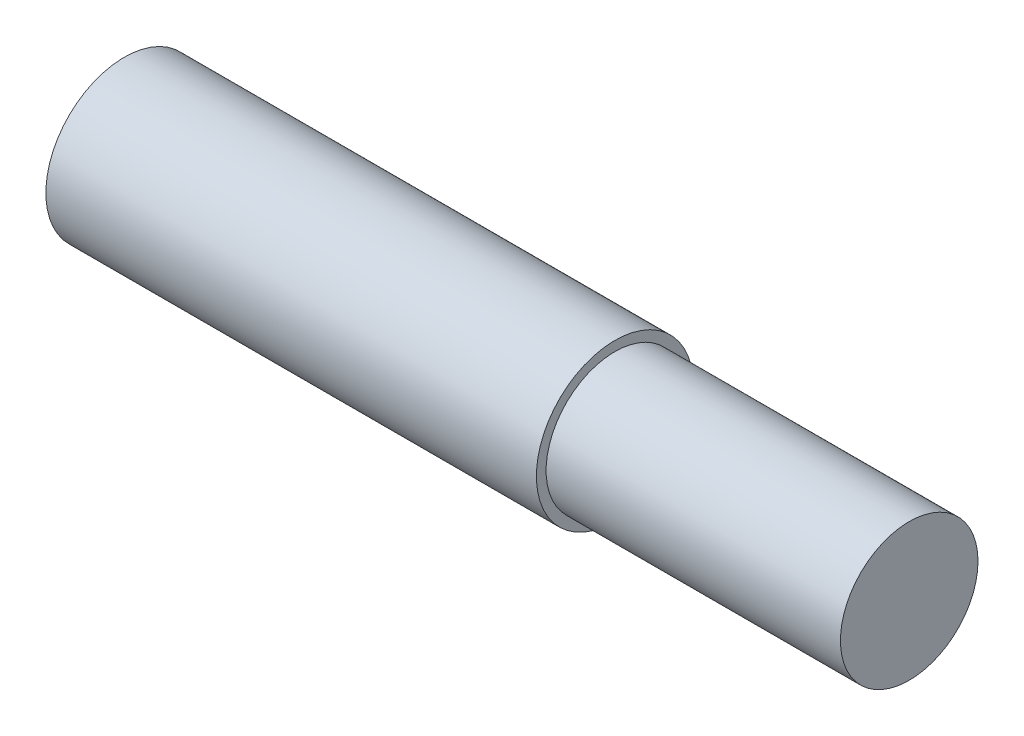
ISO-10303-21;
HEADER;
FILE_DESCRIPTION(('STEP AP214'),'2;1');
FILE_NAME('part.step','',(''),(''),'','','');
FILE_SCHEMA(('AUTOMOTIVE_DESIGN { 1 0 10303 214 1 1 1 1 }'));
ENDSEC;
DATA;
#1=APPLICATION_CONTEXT('core data for automotive mechanical design processes');
#2=APPLICATION_PROTOCOL_DEFINITION('international standard','automotive_design',2000,#1);
#3=PRODUCT_CONTEXT('',#1,'mechanical');
#4=PRODUCT('Part','Part','',(#3));
#5=PRODUCT_RELATED_PRODUCT_CATEGORY('part','',(#4));
#6=PRODUCT_DEFINITION_FORMATION('','',#4);
#7=PRODUCT_DEFINITION_CONTEXT('part definition',#1,'design');
#8=PRODUCT_DEFINITION('design','',#6,#7);
#9=PRODUCT_DEFINITION_SHAPE('','',#8);
#10=(LENGTH_UNIT() NAMED_UNIT(*) SI_UNIT(.MILLI.,.METRE.));
#11=(NAMED_UNIT(*) PLANE_ANGLE_UNIT() SI_UNIT($,.RADIAN.));
#12=(NAMED_UNIT(*) SI_UNIT($,.STERADIAN.) SOLID_ANGLE_UNIT());
#13=UNCERTAINTY_MEASURE_WITH_UNIT(LENGTH_MEASURE(1.E-05),#10,'distance_accuracy_value','');
#14=(GEOMETRIC_REPRESENTATION_CONTEXT(3) GLOBAL_UNCERTAINTY_ASSIGNED_CONTEXT((#13)) GLOBAL_UNIT_ASSIGNED_CONTEXT((#10,
#11,#12)) REPRESENTATION_CONTEXT('',''));
#15=CARTESIAN_POINT('',(0.,0.,0.));
#16=DIRECTION('',(0.,0.,1.));
#17=DIRECTION('',(1.,0.,0.));
#18=AXIS2_PLACEMENT_3D('',#15,#16,#17);
#19=CARTESIAN_POINT('',(25.,0.,0.));
#20=DIRECTION('',(-1.,0.,0.));
#21=DIRECTION('',(0.,0.,1.));
#22=AXIS2_PLACEMENT_3D('',#19,#20,#21);
#23=CYLINDRICAL_SURFACE('',#22,4.);
#24=CARTESIAN_POINT('',(25.,0.,0.));
#25=DIRECTION('',(1.,0.,0.));
#26=DIRECTION('',(0.,0.,-1.));
#27=AXIS2_PLACEMENT_3D('',#24,#25,#26);
#28=CIRCLE('',#27,4.);
#29=CARTESIAN_POINT('',(25.,0.,-4.));
#30=VERTEX_POINT('',#29);
#31=EDGE_CURVE('E49',#30,#30,#28,.T.);
#32=ORIENTED_EDGE('',*,*,#31,.F.);
#33=EDGE_LOOP('',(#32));
#34=FACE_BOUND('',#33,.T.);
#35=CARTESIAN_POINT('',(0.,0.,0.));
#36=DIRECTION('',(1.,0.,0.));
#37=DIRECTION('',(0.,0.,-1.));
#38=AXIS2_PLACEMENT_3D('',#35,#36,#37);
#39=CIRCLE('',#38,4.);
#40=CARTESIAN_POINT('',(0.,0.,-4.));
#41=VERTEX_POINT('',#40);
#42=EDGE_CURVE('E44',#41,#41,#39,.T.);
#43=ORIENTED_EDGE('',*,*,#42,.T.);
#44=EDGE_LOOP('',(#43));
#45=FACE_BOUND('',#44,.T.);
#46=ADVANCED_FACE('F41',(#34,#45),#23,.T.);
#47=CARTESIAN_POINT('',(25.,0.,0.));
#48=DIRECTION('',(1.,0.,0.));
#49=DIRECTION('',(0.,0.,-1.));
#50=AXIS2_PLACEMENT_3D('',#47,#48,#49);
#51=PLANE('',#50);
#52=CARTESIAN_POINT('',(25.,0.,0.));
#53=DIRECTION('',(1.,0.,0.));
#54=DIRECTION('',(0.,0.,-1.));
#55=AXIS2_PLACEMENT_3D('',#52,#53,#54);
#56=CIRCLE('',#55,3.5052);
#57=CARTESIAN_POINT('',(25.,0.,-3.5052));
#58=VERTEX_POINT('',#57);
#59=EDGE_CURVE('E10',#58,#58,#56,.T.);
#60=ORIENTED_EDGE('',*,*,#59,.F.);
#61=EDGE_LOOP('',(#60));
#62=FACE_BOUND('',#61,.T.);
#63=ORIENTED_EDGE('',*,*,#31,.T.);
#64=EDGE_LOOP('',(#63));
#65=FACE_BOUND('',#64,.T.);
#66=ADVANCED_FACE('F86',(#62,#65),#51,.T.);
#67=CARTESIAN_POINT('',(0.,0.,0.));
#68=DIRECTION('',(1.,0.,0.));
#69=DIRECTION('',(0.,0.,-1.));
#70=AXIS2_PLACEMENT_3D('',#67,#68,#69);
#71=PLANE('',#70);
#72=CARTESIAN_POINT('',(0.,0.,0.));
#73=DIRECTION('',(1.,0.,0.));
#74=DIRECTION('',(0.,0.,-1.));
#75=AXIS2_PLACEMENT_3D('',#72,#73,#74);
#76=CIRCLE('',#75,2.475);
#77=CARTESIAN_POINT('',(0.,0.,-2.475));
#78=VERTEX_POINT('',#77);
#79=EDGE_CURVE('E62',#78,#78,#76,.T.);
#80=ORIENTED_EDGE('',*,*,#79,.T.);
#81=EDGE_LOOP('',(#80));
#82=FACE_BOUND('',#81,.T.);
#83=ORIENTED_EDGE('',*,*,#42,.F.);
#84=EDGE_LOOP('',(#83));
#85=FACE_BOUND('',#84,.T.);
#86=ADVANCED_FACE('F91',(#82,#85),#71,.F.);
#87=CARTESIAN_POINT('',(15.,0.,0.));
#88=DIRECTION('',(-1.,0.,0.));
#89=DIRECTION('',(0.,0.,1.));
#90=AXIS2_PLACEMENT_3D('',#87,#88,#89);
#91=CYLINDRICAL_SURFACE('',#90,2.475);
#92=CARTESIAN_POINT('',(15.,0.,0.));
#93=DIRECTION('',(1.,0.,0.));
#94=DIRECTION('',(0.,0.,-1.));
#95=AXIS2_PLACEMENT_3D('',#92,#93,#94);
#96=CIRCLE('',#95,2.475);
#97=CARTESIAN_POINT('',(15.,0.,-2.475));
#98=VERTEX_POINT('',#97);
#99=EDGE_CURVE('E58',#98,#98,#96,.T.);
#100=ORIENTED_EDGE('',*,*,#99,.T.);
#101=EDGE_LOOP('',(#100));
#102=FACE_BOUND('',#101,.T.);
#103=ORIENTED_EDGE('',*,*,#79,.F.);
#104=EDGE_LOOP('',(#103));
#105=FACE_BOUND('',#104,.T.);
#106=ADVANCED_FACE('F82',(#102,#105),#91,.F.);
#107=CARTESIAN_POINT('',(15.,0.,0.));
#108=DIRECTION('',(1.,0.,0.));
#109=DIRECTION('',(0.,0.,-1.));
#110=AXIS2_PLACEMENT_3D('',#107,#108,#109);
#111=PLANE('',#110);
#112=ORIENTED_EDGE('',*,*,#99,.F.);
#113=EDGE_LOOP('',(#112));
#114=FACE_BOUND('',#113,.T.);
#115=ADVANCED_FACE('F75',(#114),#111,.F.);
#116=CARTESIAN_POINT('',(40.,0.,0.));
#117=DIRECTION('',(-1.,0.,0.));
#118=DIRECTION('',(0.,0.,1.));
#119=AXIS2_PLACEMENT_3D('',#116,#117,#118);
#120=CYLINDRICAL_SURFACE('',#119,3.5052);
#121=CARTESIAN_POINT('',(40.,0.,0.));
#122=DIRECTION('',(1.,0.,0.));
#123=DIRECTION('',(0.,0.,-1.));
#124=AXIS2_PLACEMENT_3D('',#121,#122,#123);
#125=CIRCLE('',#124,3.5052);
#126=CARTESIAN_POINT('',(40.,0.,-3.5052));
#127=VERTEX_POINT('',#126);
#128=EDGE_CURVE('E57',#127,#127,#125,.T.);
#129=ORIENTED_EDGE('',*,*,#128,.F.);
#130=EDGE_LOOP('',(#129));
#131=FACE_BOUND('',#130,.T.);
#132=ORIENTED_EDGE('',*,*,#59,.T.);
#133=EDGE_LOOP('',(#132));
#134=FACE_BOUND('',#133,.T.);
#135=ADVANCED_FACE('F73',(#131,#134),#120,.T.);
#136=CARTESIAN_POINT('',(40.,0.,0.));
#137=DIRECTION('',(1.,0.,0.));
#138=DIRECTION('',(0.,0.,-1.));
#139=AXIS2_PLACEMENT_3D('',#136,#137,#138);
#140=PLANE('',#139);
#141=ORIENTED_EDGE('',*,*,#128,.T.);
#142=EDGE_LOOP('',(#141));
#143=FACE_BOUND('',#142,.T.);
#144=ADVANCED_FACE('F71',(#143),#140,.T.);
#145=CLOSED_SHELL('',(#46,#66,#86,#106,#115,#135,#144));
#146=MANIFOLD_SOLID_BREP('B2',#145);
#147=ADVANCED_BREP_SHAPE_REPRESENTATION('',(#18,#146),#14);
#148=SHAPE_DEFINITION_REPRESENTATION(#9,#147);
ENDSEC;
END-ISO-10303-21;
